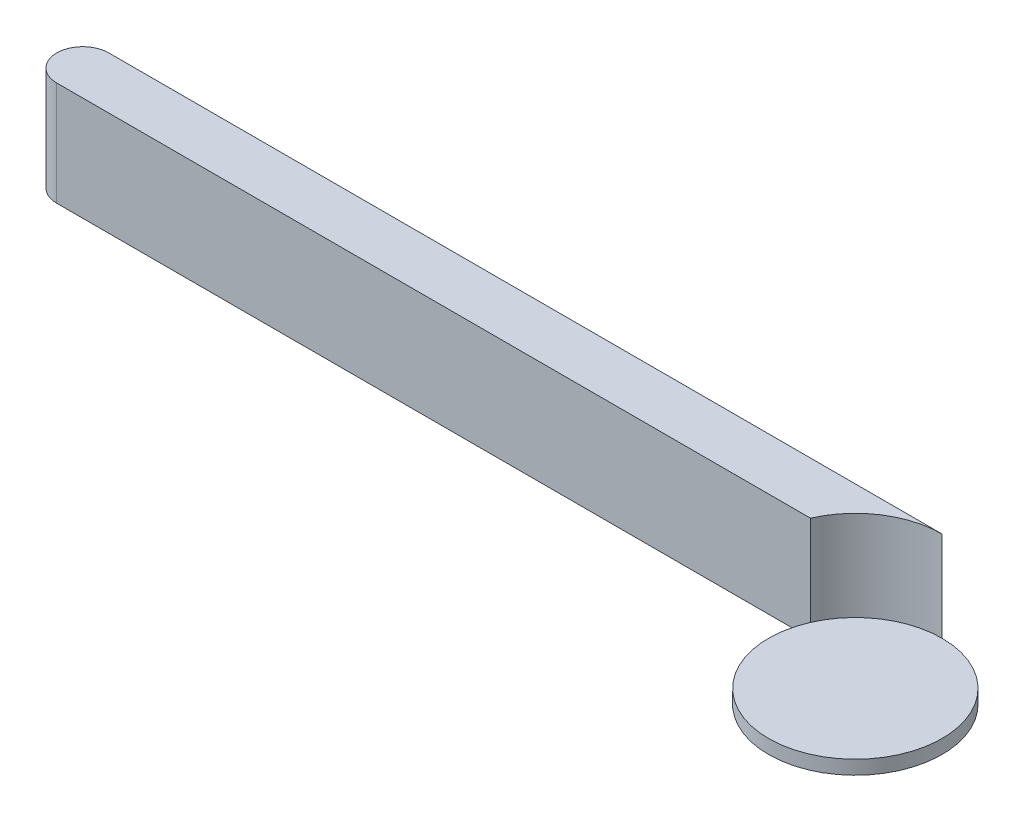
ISO-10303-21;
HEADER;
FILE_DESCRIPTION(('STEP AP214'),'2;1');
FILE_NAME('part.step','',(''),(''),'','','');
FILE_SCHEMA(('AUTOMOTIVE_DESIGN { 1 0 10303 214 1 1 1 1 }'));
ENDSEC;
DATA;
#1=APPLICATION_CONTEXT('core data for automotive mechanical design processes');
#2=APPLICATION_PROTOCOL_DEFINITION('international standard','automotive_design',2000,#1);
#3=PRODUCT_CONTEXT('',#1,'mechanical');
#4=PRODUCT('Part','Part','',(#3));
#5=PRODUCT_RELATED_PRODUCT_CATEGORY('part','',(#4));
#6=PRODUCT_DEFINITION_FORMATION('','',#4);
#7=PRODUCT_DEFINITION_CONTEXT('part definition',#1,'design');
#8=PRODUCT_DEFINITION('design','',#6,#7);
#9=PRODUCT_DEFINITION_SHAPE('','',#8);
#10=(LENGTH_UNIT() NAMED_UNIT(*) SI_UNIT(.MILLI.,.METRE.));
#11=(NAMED_UNIT(*) PLANE_ANGLE_UNIT() SI_UNIT($,.RADIAN.));
#12=(NAMED_UNIT(*) SI_UNIT($,.STERADIAN.) SOLID_ANGLE_UNIT());
#13=UNCERTAINTY_MEASURE_WITH_UNIT(LENGTH_MEASURE(1.E-05),#10,'distance_accuracy_value','');
#14=(GEOMETRIC_REPRESENTATION_CONTEXT(3) GLOBAL_UNCERTAINTY_ASSIGNED_CONTEXT((#13)) GLOBAL_UNIT_ASSIGNED_CONTEXT((#10,
#11,#12)) REPRESENTATION_CONTEXT('',''));
#15=CARTESIAN_POINT('',(0.,0.,0.));
#16=DIRECTION('',(0.,0.,1.));
#17=DIRECTION('',(1.,0.,0.));
#18=AXIS2_PLACEMENT_3D('',#15,#16,#17);
#19=CARTESIAN_POINT('',(152.4,19.05,11.1125));
#20=DIRECTION('',(0.,-1.,0.));
#21=DIRECTION('',(0.,0.,-1.));
#22=AXIS2_PLACEMENT_3D('',#19,#20,#21);
#23=CYLINDRICAL_SURFACE('',#22,15.875);
#24=CARTESIAN_POINT('',(152.4,2.54,11.1125));
#25=DIRECTION('',(0.,1.,0.));
#26=DIRECTION('',(0.,0.,1.));
#27=AXIS2_PLACEMENT_3D('',#24,#25,#26);
#28=CIRCLE('',#27,15.875);
#29=CARTESIAN_POINT('',(137.850322168515,2.54,4.76249999999999));
#30=VERTEX_POINT('',#29);
#31=CARTESIAN_POINT('',(152.4,2.54,-4.7625));
#32=VERTEX_POINT('',#31);
#33=EDGE_CURVE('E92',#30,#32,#28,.T.);
#34=ORIENTED_EDGE('',*,*,#33,.F.);
#35=DIRECTION('',(0.,-1.,0.));
#36=VECTOR('',#35,1.);
#37=CARTESIAN_POINT('',(137.850322168515,19.05,4.7625));
#38=LINE('',#37,#36);
#39=CARTESIAN_POINT('',(137.850322168515,0.,4.7625));
#40=VERTEX_POINT('',#39);
#41=EDGE_CURVE('E109',#30,#40,#38,.T.);
#42=ORIENTED_EDGE('',*,*,#41,.T.);
#43=CARTESIAN_POINT('',(152.4,0.,11.1125));
#44=DIRECTION('',(0.,1.,0.));
#45=DIRECTION('',(0.,0.,1.));
#46=AXIS2_PLACEMENT_3D('',#43,#44,#45);
#47=CIRCLE('',#46,15.875);
#48=CARTESIAN_POINT('',(152.4,0.,-4.76249999999999));
#49=VERTEX_POINT('',#48);
#50=EDGE_CURVE('E105',#40,#49,#47,.T.);
#51=ORIENTED_EDGE('',*,*,#50,.T.);
#52=DIRECTION('',(0.,-1.,0.));
#53=VECTOR('',#52,1.);
#54=CARTESIAN_POINT('',(152.4,19.05,-4.76249999999999));
#55=LINE('',#54,#53);
#56=EDGE_CURVE('E71',#32,#49,#55,.T.);
#57=ORIENTED_EDGE('',*,*,#56,.F.);
#58=EDGE_LOOP('',(#34,#42,#51,#57));
#59=FACE_BOUND('',#58,.T.);
#60=ADVANCED_FACE('F35',(#59),#23,.T.);
#61=CARTESIAN_POINT('',(0.,19.05,0.));
#62=DIRECTION('',(0.,-1.,0.));
#63=DIRECTION('',(0.,0.,-1.));
#64=AXIS2_PLACEMENT_3D('',#61,#62,#63);
#65=CYLINDRICAL_SURFACE('',#64,4.7625);
#66=CARTESIAN_POINT('',(0.,0.,0.));
#67=DIRECTION('',(0.,1.,0.));
#68=DIRECTION('',(0.,0.,1.));
#69=AXIS2_PLACEMENT_3D('',#66,#67,#68);
#70=CIRCLE('',#69,4.7625);
#71=CARTESIAN_POINT('',(0.,0.,-4.7625));
#72=VERTEX_POINT('',#71);
#73=CARTESIAN_POINT('',(0.,0.,4.7625));
#74=VERTEX_POINT('',#73);
#75=EDGE_CURVE('E103',#72,#74,#70,.T.);
#76=ORIENTED_EDGE('',*,*,#75,.T.);
#77=DIRECTION('',(0.,-1.,0.));
#78=VECTOR('',#77,1.);
#79=CARTESIAN_POINT('',(0.,19.05,4.7625));
#80=LINE('',#79,#78);
#81=CARTESIAN_POINT('',(0.,19.05,4.7625));
#82=VERTEX_POINT('',#81);
#83=EDGE_CURVE('E11',#82,#74,#80,.T.);
#84=ORIENTED_EDGE('',*,*,#83,.F.);
#85=CARTESIAN_POINT('',(0.,19.05,0.));
#86=DIRECTION('',(0.,1.,0.));
#87=DIRECTION('',(0.,0.,1.));
#88=AXIS2_PLACEMENT_3D('',#85,#86,#87);
#89=CIRCLE('',#88,4.7625);
#90=CARTESIAN_POINT('',(0.,19.05,-4.7625));
#91=VERTEX_POINT('',#90);
#92=EDGE_CURVE('E113',#91,#82,#89,.T.);
#93=ORIENTED_EDGE('',*,*,#92,.F.);
#94=DIRECTION('',(0.,-1.,0.));
#95=VECTOR('',#94,1.);
#96=CARTESIAN_POINT('',(0.,19.05,-4.7625));
#97=LINE('',#96,#95);
#98=EDGE_CURVE('E106',#91,#72,#97,.T.);
#99=ORIENTED_EDGE('',*,*,#98,.T.);
#100=EDGE_LOOP('',(#76,#84,#93,#99));
#101=FACE_BOUND('',#100,.T.);
#102=ADVANCED_FACE('F37',(#101),#65,.T.);
#103=CARTESIAN_POINT('',(0.,19.05,4.7625));
#104=DIRECTION('',(0.,0.,-1.));
#105=DIRECTION('',(-1.,0.,0.));
#106=AXIS2_PLACEMENT_3D('',#103,#104,#105);
#107=PLANE('',#106);
#108=DIRECTION('',(1.,0.,0.));
#109=VECTOR('',#108,1.);
#110=CARTESIAN_POINT('',(0.,0.,4.7625));
#111=LINE('',#110,#109);
#112=EDGE_CURVE('E115',#74,#40,#111,.T.);
#113=ORIENTED_EDGE('',*,*,#112,.T.);
#114=ORIENTED_EDGE('',*,*,#41,.F.);
#115=CARTESIAN_POINT('',(137.850322168515,19.05,4.7625));
#116=VERTEX_POINT('',#115);
#117=EDGE_CURVE('E44',#116,#30,#38,.T.);
#118=ORIENTED_EDGE('',*,*,#117,.F.);
#119=DIRECTION('',(1.,0.,0.));
#120=VECTOR('',#119,1.);
#121=CARTESIAN_POINT('',(0.,19.05,4.7625));
#122=LINE('',#121,#120);
#123=EDGE_CURVE('E80',#82,#116,#122,.T.);
#124=ORIENTED_EDGE('',*,*,#123,.F.);
#125=ORIENTED_EDGE('',*,*,#83,.T.);
#126=EDGE_LOOP('',(#113,#114,#118,#124,#125));
#127=FACE_BOUND('',#126,.T.);
#128=ADVANCED_FACE('F126',(#127),#107,.F.);
#129=CARTESIAN_POINT('',(0.,19.05,-4.7625));
#130=DIRECTION('',(0.,0.,1.));
#131=DIRECTION('',(1.,0.,0.));
#132=AXIS2_PLACEMENT_3D('',#129,#130,#131);
#133=PLANE('',#132);
#134=DIRECTION('',(-1.,0.,0.));
#135=VECTOR('',#134,1.);
#136=CARTESIAN_POINT('',(0.,0.,-4.7625));
#137=LINE('',#136,#135);
#138=EDGE_CURVE('E74',#49,#72,#137,.T.);
#139=ORIENTED_EDGE('',*,*,#138,.T.);
#140=ORIENTED_EDGE('',*,*,#98,.F.);
#141=DIRECTION('',(-1.,0.,0.));
#142=VECTOR('',#141,1.);
#143=CARTESIAN_POINT('',(0.,19.05,-4.7625));
#144=LINE('',#143,#142);
#145=CARTESIAN_POINT('',(152.4,19.05,-4.76249999999999));
#146=VERTEX_POINT('',#145);
#147=EDGE_CURVE('E52',#146,#91,#144,.T.);
#148=ORIENTED_EDGE('',*,*,#147,.F.);
#149=EDGE_CURVE('E102',#146,#32,#55,.T.);
#150=ORIENTED_EDGE('',*,*,#149,.T.);
#151=ORIENTED_EDGE('',*,*,#56,.T.);
#152=EDGE_LOOP('',(#139,#140,#148,#150,#151));
#153=FACE_BOUND('',#152,.T.);
#154=ADVANCED_FACE('F108',(#153),#133,.F.);
#155=CARTESIAN_POINT('',(0.,19.05,0.));
#156=DIRECTION('',(0.,1.,0.));
#157=DIRECTION('',(0.,0.,1.));
#158=AXIS2_PLACEMENT_3D('',#155,#156,#157);
#159=PLANE('',#158);
#160=CARTESIAN_POINT('',(152.4,19.05,11.1125));
#161=DIRECTION('',(0.,1.,0.));
#162=DIRECTION('',(0.,0.,1.));
#163=AXIS2_PLACEMENT_3D('',#160,#161,#162);
#164=CIRCLE('',#163,15.875);
#165=EDGE_CURVE('E98',#146,#116,#164,.T.);
#166=ORIENTED_EDGE('',*,*,#165,.F.);
#167=ORIENTED_EDGE('',*,*,#147,.T.);
#168=ORIENTED_EDGE('',*,*,#92,.T.);
#169=ORIENTED_EDGE('',*,*,#123,.T.);
#170=EDGE_LOOP('',(#166,#167,#168,#169));
#171=FACE_BOUND('',#170,.T.);
#172=ADVANCED_FACE('F123',(#171),#159,.T.);
#173=CARTESIAN_POINT('',(0.,0.,0.));
#174=DIRECTION('',(0.,1.,0.));
#175=DIRECTION('',(0.,0.,1.));
#176=AXIS2_PLACEMENT_3D('',#173,#174,#175);
#177=PLANE('',#176);
#178=ORIENTED_EDGE('',*,*,#75,.F.);
#179=ORIENTED_EDGE('',*,*,#138,.F.);
#180=ORIENTED_EDGE('',*,*,#50,.F.);
#181=ORIENTED_EDGE('',*,*,#112,.F.);
#182=EDGE_LOOP('',(#178,#179,#180,#181));
#183=FACE_BOUND('',#182,.T.);
#184=ADVANCED_FACE('F129',(#183),#177,.F.);
#185=CARTESIAN_POINT('',(152.4,2.54,11.1125));
#186=DIRECTION('',(0.,1.,0.));
#187=DIRECTION('',(0.,0.,1.));
#188=AXIS2_PLACEMENT_3D('',#185,#186,#187);
#189=CYLINDRICAL_SURFACE('',#188,15.875);
#190=EDGE_CURVE('E95',#32,#30,#28,.T.);
#191=ORIENTED_EDGE('',*,*,#190,.F.);
#192=ORIENTED_EDGE('',*,*,#149,.F.);
#193=ORIENTED_EDGE('',*,*,#165,.T.);
#194=ORIENTED_EDGE('',*,*,#117,.T.);
#195=EDGE_LOOP('',(#191,#192,#193,#194));
#196=FACE_BOUND('',#195,.T.);
#197=ADVANCED_FACE('F101',(#196),#189,.F.);
#198=CARTESIAN_POINT('',(152.4,2.54,11.1125));
#199=DIRECTION('',(0.,1.,0.));
#200=DIRECTION('',(0.,0.,1.));
#201=AXIS2_PLACEMENT_3D('',#198,#199,#200);
#202=PLANE('',#201);
#203=ORIENTED_EDGE('',*,*,#190,.T.);
#204=ORIENTED_EDGE('',*,*,#33,.T.);
#205=EDGE_LOOP('',(#203,#204));
#206=FACE_BOUND('',#205,.T.);
#207=ADVANCED_FACE('F94',(#206),#202,.T.);
#208=CLOSED_SHELL('',(#60,#102,#128,#154,#172,#184,#197,#207));
#209=MANIFOLD_SOLID_BREP('B2',#208);
#210=ADVANCED_BREP_SHAPE_REPRESENTATION('',(#18,#209),#14);
#211=SHAPE_DEFINITION_REPRESENTATION(#9,#210);
ENDSEC;
END-ISO-10303-21;
